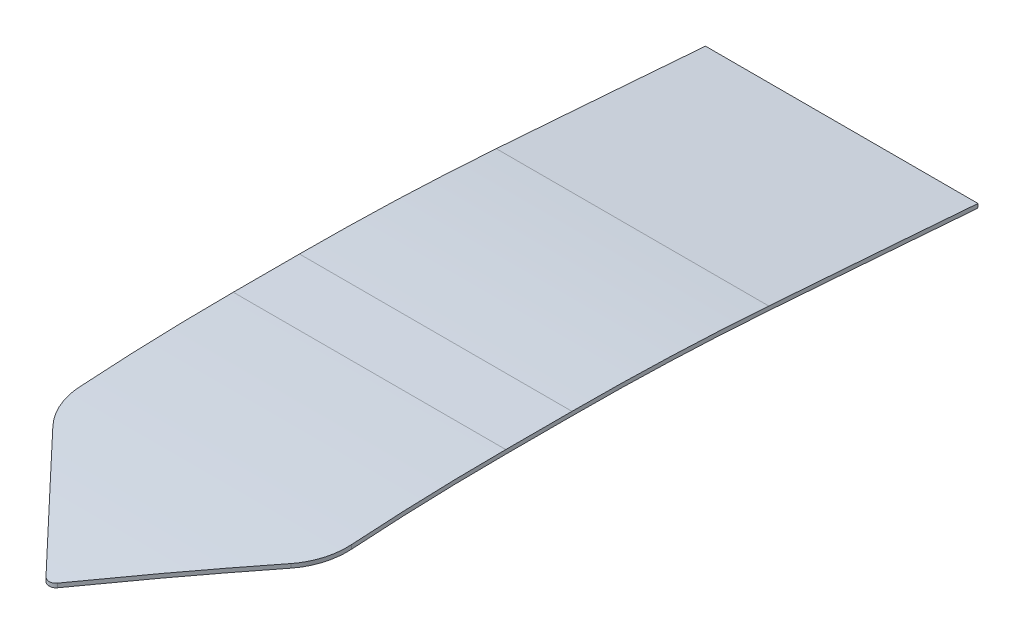
ISO-10303-21;
HEADER;
FILE_DESCRIPTION(('STEP AP214'),'2;1');
FILE_NAME('part.step','',(''),(''),'','','');
FILE_SCHEMA(('AUTOMOTIVE_DESIGN { 1 0 10303 214 1 1 1 1 }'));
ENDSEC;
DATA;
#1=APPLICATION_CONTEXT('core data for automotive mechanical design processes');
#2=APPLICATION_PROTOCOL_DEFINITION('international standard','automotive_design',2000,#1);
#3=PRODUCT_CONTEXT('',#1,'mechanical');
#4=PRODUCT('Part','Part','',(#3));
#5=PRODUCT_RELATED_PRODUCT_CATEGORY('part','',(#4));
#6=PRODUCT_DEFINITION_FORMATION('','',#4);
#7=PRODUCT_DEFINITION_CONTEXT('part definition',#1,'design');
#8=PRODUCT_DEFINITION('design','',#6,#7);
#9=PRODUCT_DEFINITION_SHAPE('','',#8);
#10=(LENGTH_UNIT() NAMED_UNIT(*) SI_UNIT(.MILLI.,.METRE.));
#11=(NAMED_UNIT(*) PLANE_ANGLE_UNIT() SI_UNIT($,.RADIAN.));
#12=(NAMED_UNIT(*) SI_UNIT($,.STERADIAN.) SOLID_ANGLE_UNIT());
#13=UNCERTAINTY_MEASURE_WITH_UNIT(LENGTH_MEASURE(1.E-05),#10,'distance_accuracy_value','');
#14=(GEOMETRIC_REPRESENTATION_CONTEXT(3) GLOBAL_UNCERTAINTY_ASSIGNED_CONTEXT((#13)) GLOBAL_UNIT_ASSIGNED_CONTEXT((#10,
#11,#12)) REPRESENTATION_CONTEXT('',''));
#15=CARTESIAN_POINT('',(0.,0.,0.));
#16=DIRECTION('',(0.,0.,1.));
#17=DIRECTION('',(1.,0.,0.));
#18=AXIS2_PLACEMENT_3D('',#15,#16,#17);
#19=CARTESIAN_POINT('',(45.2232043677211,2377.37290200874,4692.88338211628));
#20=DIRECTION('',(0.,-0.139146483242731,0.990271809252985));
#21=DIRECTION('',(0.,-0.990271809252985,-0.139146483242731));
#22=AXIS2_PLACEMENT_3D('',#19,#20,#21);
#23=PLANE('',#22);
#24=CARTESIAN_POINT('',(914.223204367722,2000.18474268708,4639.88338211628));
#25=DIRECTION('',(0.,-0.139146483242731,0.990271809252985));
#26=DIRECTION('',(0.,-0.990271809252985,-0.139146483242731));
#27=AXIS2_PLACEMENT_3D('',#24,#25,#26);
#28=ELLIPSE('',#27,359.333551483146,50.0000000000007);
#29=CARTESIAN_POINT('',(906.933035038163,2352.21999805371,4689.34906144191));
#30=VERTEX_POINT('',#29);
#31=CARTESIAN_POINT('',(921.513373697281,2352.21999805371,4689.34906144191));
#32=VERTEX_POINT('',#31);
#33=EDGE_CURVE('E66',#30,#32,#28,.F.);
#34=ORIENTED_EDGE('',*,*,#33,.F.);
#35=DIRECTION('',(1.,0.,0.));
#36=VECTOR('',#35,1.);
#37=CARTESIAN_POINT('',(45.2232043677211,2352.21999805371,4689.34906144191));
#38=LINE('',#37,#36);
#39=EDGE_CURVE('E194',#30,#32,#38,.T.);
#40=ORIENTED_EDGE('',*,*,#39,.T.);
#41=EDGE_LOOP('',(#34,#40));
#42=FACE_BOUND('',#41,.T.);
#43=ADVANCED_FACE('F37',(#42),#23,.T.);
#44=CARTESIAN_POINT('',(45.2232043677211,-264700.723222564,20532.1872081631));
#45=DIRECTION('',(1.,0.,0.));
#46=DIRECTION('',(0.,0.,-1.));
#47=AXIS2_PLACEMENT_3D('',#44,#45,#46);
#48=CYLINDRICAL_SURFACE('',#47,267886.279258507);
#49=CARTESIAN_POINT('',(1773.22320436772,-264700.723222564,20532.1872081631));
#50=DIRECTION('',(-1.,0.,0.));
#51=DIRECTION('',(0.,0.,1.));
#52=AXIS2_PLACEMENT_3D('',#49,#50,#51);
#53=CIRCLE('',#52,267886.279258507);
#54=CARTESIAN_POINT('',(1773.22320436772,2373.84259870677,-306.11661788372));
#55=VERTEX_POINT('',#54);
#56=CARTESIAN_POINT('',(1773.22320436772,2473.47300835498,1012.77422187486));
#57=VERTEX_POINT('',#56);
#58=EDGE_CURVE('E170',#55,#57,#53,.F.);
#59=ORIENTED_EDGE('',*,*,#58,.F.);
#60=DIRECTION('',(1.,0.,0.));
#61=VECTOR('',#60,1.);
#62=CARTESIAN_POINT('',(45.2232043677211,2373.84259870677,-306.11661788372));
#63=LINE('',#62,#61);
#64=CARTESIAN_POINT('',(55.2232043677214,2373.84259870683,-306.116617883722));
#65=VERTEX_POINT('',#64);
#66=EDGE_CURVE('E164',#65,#55,#63,.T.);
#67=ORIENTED_EDGE('',*,*,#66,.F.);
#68=CARTESIAN_POINT('',(55.2232043677249,-264700.723222564,20532.1872081631));
#69=DIRECTION('',(1.,0.,0.));
#70=DIRECTION('',(0.,0.,-1.));
#71=AXIS2_PLACEMENT_3D('',#68,#69,#70);
#72=CIRCLE('',#71,267886.279258507);
#73=CARTESIAN_POINT('',(55.2232043677217,2473.47300835498,1012.77422187486));
#74=VERTEX_POINT('',#73);
#75=EDGE_CURVE('E147',#74,#65,#72,.F.);
#76=ORIENTED_EDGE('',*,*,#75,.F.);
#77=DIRECTION('',(1.,0.,0.));
#78=VECTOR('',#77,1.);
#79=CARTESIAN_POINT('',(45.2232043677211,2473.47300835497,1012.77422187486));
#80=LINE('',#79,#78);
#81=EDGE_CURVE('E203',#74,#57,#80,.T.);
#82=ORIENTED_EDGE('',*,*,#81,.T.);
#83=EDGE_LOOP('',(#59,#67,#76,#82));
#84=FACE_BOUND('',#83,.T.);
#85=ADVANCED_FACE('F39',(#84),#48,.T.);
#86=CARTESIAN_POINT('',(45.2232043677211,2373.84259870677,-306.11661788372));
#87=DIRECTION('',(0.,-0.0777878728384363,-0.996969932765914));
#88=DIRECTION('',(0.,0.996969932765914,-0.0777878728384363));
#89=AXIS2_PLACEMENT_3D('',#86,#87,#88);
#90=PLANE('',#89);
#91=DIRECTION('',(0.,0.996969932765914,-0.0777878728384363));
#92=VECTOR('',#91,1.);
#93=CARTESIAN_POINT('',(1773.22320436772,2373.84259870677,-306.11661788372));
#94=LINE('',#93,#92);
#95=CARTESIAN_POINT('',(1773.22320436772,2348.51956241448,-304.14080591362));
#96=VERTEX_POINT('',#95);
#97=EDGE_CURVE('E326',#96,#55,#94,.T.);
#98=ORIENTED_EDGE('',*,*,#97,.F.);
#99=DIRECTION('',(1.,0.,0.));
#100=VECTOR('',#99,1.);
#101=CARTESIAN_POINT('',(45.2232043677211,2348.51956241448,-304.140805913644));
#102=LINE('',#101,#100);
#103=CARTESIAN_POINT('',(55.2232043677214,2348.51956241448,-304.14080591362));
#104=VERTEX_POINT('',#103);
#105=EDGE_CURVE('E166',#104,#96,#102,.T.);
#106=ORIENTED_EDGE('',*,*,#105,.F.);
#107=DIRECTION('',(0.,-0.996969932765914,0.0777878728384363));
#108=VECTOR('',#107,1.);
#109=CARTESIAN_POINT('',(55.2232043677214,2373.84259870677,-306.11661788372));
#110=LINE('',#109,#108);
#111=EDGE_CURVE('E150',#65,#104,#110,.T.);
#112=ORIENTED_EDGE('',*,*,#111,.F.);
#113=ORIENTED_EDGE('',*,*,#66,.T.);
#114=EDGE_LOOP('',(#98,#106,#112,#113));
#115=FACE_BOUND('',#114,.T.);
#116=ADVANCED_FACE('F163',(#115),#90,.T.);
#117=CARTESIAN_POINT('',(45.2232043677211,-264700.723222564,20532.1872081631));
#118=DIRECTION('',(1.,0.,0.));
#119=DIRECTION('',(0.,0.,-1.));
#120=AXIS2_PLACEMENT_3D('',#117,#118,#119);
#121=CYLINDRICAL_SURFACE('',#120,267860.879258507);
#122=CARTESIAN_POINT('',(1773.22320436772,-264700.723222564,20532.1872081631));
#123=DIRECTION('',(-1.,0.,0.));
#124=DIRECTION('',(0.,0.,1.));
#125=AXIS2_PLACEMENT_3D('',#122,#123,#124);
#126=CIRCLE('',#125,267860.879258507);
#127=CARTESIAN_POINT('',(1773.22320436772,2448.14052547071,1014.62498142564));
#128=VERTEX_POINT('',#127);
#129=EDGE_CURVE('E328',#128,#96,#126,.T.);
#130=ORIENTED_EDGE('',*,*,#129,.F.);
#131=DIRECTION('',(1.,0.,0.));
#132=VECTOR('',#131,1.);
#133=CARTESIAN_POINT('',(45.2232043677211,2448.14052547069,1014.62498142564));
#134=LINE('',#133,#132);
#135=CARTESIAN_POINT('',(55.2232043677217,2448.14052547071,1014.62498142564));
#136=VERTEX_POINT('',#135);
#137=EDGE_CURVE('E174',#136,#128,#134,.T.);
#138=ORIENTED_EDGE('',*,*,#137,.F.);
#139=CARTESIAN_POINT('',(55.2232043677249,-264700.723222564,20532.1872081631));
#140=DIRECTION('',(1.,0.,0.));
#141=DIRECTION('',(0.,0.,-1.));
#142=AXIS2_PLACEMENT_3D('',#139,#140,#141);
#143=CIRCLE('',#142,267860.879258507);
#144=EDGE_CURVE('E167',#104,#136,#143,.T.);
#145=ORIENTED_EDGE('',*,*,#144,.F.);
#146=ORIENTED_EDGE('',*,*,#105,.T.);
#147=EDGE_LOOP('',(#130,#138,#145,#146));
#148=FACE_BOUND('',#147,.T.);
#149=ADVANCED_FACE('F276',(#148),#121,.F.);
#150=CARTESIAN_POINT('',(45.2232043677211,-14509.8457253538,2253.55427068807));
#151=DIRECTION('',(1.,0.,0.));
#152=DIRECTION('',(0.,0.,-1.));
#153=AXIS2_PLACEMENT_3D('',#150,#151,#152);
#154=CYLINDRICAL_SURFACE('',#153,17003.1833333334);
#155=CARTESIAN_POINT('',(1773.22320436772,-14509.8457253538,2253.55427068807));
#156=DIRECTION('',(-1.,0.,0.));
#157=DIRECTION('',(0.,0.,1.));
#158=AXIS2_PLACEMENT_3D('',#155,#156,#157);
#159=CIRCLE('',#158,17003.1833333334);
#160=CARTESIAN_POINT('',(1773.22320436772,2493.33760797954,2253.55427068807));
#161=VERTEX_POINT('',#160);
#162=EDGE_CURVE('E330',#161,#128,#159,.T.);
#163=ORIENTED_EDGE('',*,*,#162,.F.);
#164=DIRECTION('',(1.,0.,0.));
#165=VECTOR('',#164,1.);
#166=CARTESIAN_POINT('',(45.2232043677211,2493.33760797949,2253.55427068807));
#167=LINE('',#166,#165);
#168=CARTESIAN_POINT('',(55.2232043677219,2493.33760797954,2253.55427068807));
#169=VERTEX_POINT('',#168);
#170=EDGE_CURVE('E188',#169,#161,#167,.T.);
#171=ORIENTED_EDGE('',*,*,#170,.F.);
#172=CARTESIAN_POINT('',(55.2232043677219,-14509.8457253538,2253.55427068807));
#173=DIRECTION('',(1.,0.,0.));
#174=DIRECTION('',(0.,0.,-1.));
#175=AXIS2_PLACEMENT_3D('',#172,#173,#174);
#176=CIRCLE('',#175,17003.1833333334);
#177=EDGE_CURVE('E315',#136,#169,#176,.T.);
#178=ORIENTED_EDGE('',*,*,#177,.F.);
#179=ORIENTED_EDGE('',*,*,#137,.T.);
#180=EDGE_LOOP('',(#163,#171,#178,#179));
#181=FACE_BOUND('',#180,.T.);
#182=ADVANCED_FACE('F278',(#181),#154,.F.);
#183=CARTESIAN_POINT('',(45.2232043677211,2493.33760797949,2670.88338211628));
#184=DIRECTION('',(0.,-1.,0.));
#185=DIRECTION('',(0.,0.,-1.));
#186=AXIS2_PLACEMENT_3D('',#183,#184,#185);
#187=PLANE('',#186);
#188=DIRECTION('',(0.,0.,-1.));
#189=VECTOR('',#188,1.);
#190=CARTESIAN_POINT('',(1773.22320436772,2493.33760797949,2670.88338211628));
#191=LINE('',#190,#189);
#192=CARTESIAN_POINT('',(1773.22320436772,2493.33760797949,2670.88338211628));
#193=VERTEX_POINT('',#192);
#194=EDGE_CURVE('E332',#193,#161,#191,.T.);
#195=ORIENTED_EDGE('',*,*,#194,.F.);
#196=DIRECTION('',(1.,0.,0.));
#197=VECTOR('',#196,1.);
#198=CARTESIAN_POINT('',(45.2232043677211,2493.33760797949,2670.88338211628));
#199=LINE('',#198,#197);
#200=CARTESIAN_POINT('',(55.2232043677219,2493.33760797949,2670.88338211628));
#201=VERTEX_POINT('',#200);
#202=EDGE_CURVE('E191',#201,#193,#199,.T.);
#203=ORIENTED_EDGE('',*,*,#202,.F.);
#204=DIRECTION('',(0.,0.,1.));
#205=VECTOR('',#204,1.);
#206=CARTESIAN_POINT('',(55.2232043677219,2493.33760797949,2670.88338211628));
#207=LINE('',#206,#205);
#208=EDGE_CURVE('E317',#169,#201,#207,.T.);
#209=ORIENTED_EDGE('',*,*,#208,.F.);
#210=ORIENTED_EDGE('',*,*,#170,.T.);
#211=EDGE_LOOP('',(#195,#203,#209,#210));
#212=FACE_BOUND('',#211,.T.);
#213=ADVANCED_FACE('F253',(#212),#187,.T.);
#214=CARTESIAN_POINT('',(45.2232043677211,-12012.7112139923,2670.88338211628));
#215=DIRECTION('',(1.,0.,0.));
#216=DIRECTION('',(0.,0.,-1.));
#217=AXIS2_PLACEMENT_3D('',#214,#215,#216);
#218=CYLINDRICAL_SURFACE('',#217,14506.0488219718);
#219=CARTESIAN_POINT('',(921.51337369727,2352.21999805371,4689.34906144192));
#220=CARTESIAN_POINT('',(922.21506473011,2352.23452767716,4689.2456569626));
#221=CARTESIAN_POINT('',(922.914502984035,2352.25115589871,4689.12731048837));
#222=CARTESIAN_POINT('',(924.30760756184,2352.28856881362,4688.86100444222));
#223=CARTESIAN_POINT('',(925.001273883102,2352.30935350887,4688.71304485686));
#224=CARTESIAN_POINT('',(926.381498700596,2352.3550363536,4688.38779980709));
#225=CARTESIAN_POINT('',(927.068057899352,2352.37993409231,4688.21051727118));
#226=CARTESIAN_POINT('',(928.43282260401,2352.433788896,4687.82698788175));
#227=CARTESIAN_POINT('',(929.111028167007,2352.46274593322,4687.62074122633));
#228=CARTESIAN_POINT('',(931.094306615048,2352.55392260533,4686.97121979929));
#229=CARTESIAN_POINT('',(932.386326708612,2352.62172298832,4686.48808740303));
#230=CARTESIAN_POINT('',(934.925127448912,2352.77193822164,4685.4172042993));
#231=CARTESIAN_POINT('',(936.171909910408,2352.85435248493,4684.82945779415));
#232=CARTESIAN_POINT('',(938.606117434128,2353.03273853764,4683.5566111077));
#233=CARTESIAN_POINT('',(939.793797341582,2353.12864375881,4682.87198884635));
#234=CARTESIAN_POINT('',(942.108328880202,2353.33360374526,4681.40800670519));
#235=CARTESIAN_POINT('',(943.235177718645,2353.44265911351,4680.62864248115));
#236=CARTESIAN_POINT('',(944.889169256061,2353.61706770111,4679.38140573184));
#237=CARTESIAN_POINT('',(945.441692034682,2353.67791179112,4678.9461588684));
#238=CARTESIAN_POINT('',(946.527722079309,2353.80273837289,4678.05290293244));
#239=CARTESIAN_POINT('',(947.061229177571,2353.86672089232,4677.5948936592));
#240=CARTESIAN_POINT('',(948.108261625646,2353.99769779909,4676.65697189825));
#241=CARTESIAN_POINT('',(948.621786300946,2354.06469228792,4676.17705867236));
#242=CARTESIAN_POINT('',(949.627959871744,2354.20156105467,4675.19622818642));
#243=CARTESIAN_POINT('',(950.120608962849,2354.27143530558,4674.69531112327));
#244=CARTESIAN_POINT('',(950.602387573722,2354.34268503065,4674.18433005164));
#245=B_SPLINE_CURVE_WITH_KNOTS('',3,(#219,#220,#221,#222,#223,#224,#225,#226,#227,#228,#229,
#230,#231,#232,#233,#234,#235,#236,#237,#238,#239,#240,#241,#242,#243,#244),.UNSPECIFIED.,.F.,
.F.,(4,2,2,2,2,2,2,2,2,2,2,2,4),(0.,2.12807673484801,4.2561544351893,6.38401973144155,
8.5118704760785,12.6498508082088,16.7876649564927,20.9057349002427,25.0239937419562,
27.1414445137977,29.2589139597743,31.3764548198833,33.4939758340309),.UNSPECIFIED.);
#246=CARTESIAN_POINT('',(950.602387573723,2354.34268503065,4674.18433005164));
#247=VERTEX_POINT('',#246);
#248=EDGE_CURVE('E177',#32,#247,#245,.T.);
#249=ORIENTED_EDGE('',*,*,#248,.F.);
#250=ORIENTED_EDGE('',*,*,#39,.F.);
#251=CARTESIAN_POINT('',(877.844021161721,2354.34268503065,4674.18433005164));
#252=CARTESIAN_POINT('',(878.329861245632,2354.27083461355,4674.69961910379));
#253=CARTESIAN_POINT('',(878.826756079497,2354.20038299,4675.2046735263));
#254=CARTESIAN_POINT('',(879.841767295522,2354.06240933201,4676.19341565996));
#255=CARTESIAN_POINT('',(880.359883886545,2353.99488732641,4676.67710316072));
#256=CARTESIAN_POINT('',(881.416429123758,2353.86290781771,4677.62219313671));
#257=CARTESIAN_POINT('',(881.954857310566,2353.79845024539,4678.08359611541));
#258=CARTESIAN_POINT('',(883.05102714749,2353.67272994211,4678.98323202015));
#259=CARTESIAN_POINT('',(883.608768617699,2353.6114671814,4679.42146516193));
#260=CARTESIAN_POINT('',(885.278282889158,2353.43593898185,4680.67668123549));
#261=CARTESIAN_POINT('',(886.415804383918,2353.32626177184,4681.46046882292));
#262=CARTESIAN_POINT('',(888.752471660079,2353.12029638244,4682.93159054564));
#263=CARTESIAN_POINT('',(889.951613715059,2353.02400739473,4683.6189305041));
#264=CARTESIAN_POINT('',(892.389395376219,2352.84655930235,4684.88504337178));
#265=CARTESIAN_POINT('',(893.627422017235,2352.76523890806,4685.46497411815));
#266=CARTESIAN_POINT('',(896.147743799084,2352.61698884484,4686.52182574149));
#267=CARTESIAN_POINT('',(897.430040117132,2352.55005955894,4686.9987438767));
#268=CARTESIAN_POINT('',(899.397891188829,2352.46002759352,4687.64010349548));
#269=CARTESIAN_POINT('',(900.07065915465,2352.43143132342,4687.84377877053));
#270=CARTESIAN_POINT('',(901.42437756804,2352.37823156894,4688.22264042833));
#271=CARTESIAN_POINT('',(902.105328068041,2352.35362811016,4688.39782662843));
#272=CARTESIAN_POINT('',(903.474202299119,2352.30846559128,4688.7193658194));
#273=CARTESIAN_POINT('',(904.162126779059,2352.28790697046,4688.86571567861));
#274=CARTESIAN_POINT('',(905.543640840506,2352.25087708823,4689.12929485086));
#275=CARTESIAN_POINT('',(906.237230420717,2352.23440582589,4689.24652417057));
#276=CARTESIAN_POINT('',(906.933035038174,2352.21999805371,4689.34906144192));
#277=B_SPLINE_CURVE_WITH_KNOTS('',3,(#251,#252,#253,#254,#255,#256,#257,#258,#259,#260,#261,
#262,#263,#264,#265,#266,#267,#268,#269,#270,#271,#272,#273,#274,#275,#276),.UNSPECIFIED.,.F.,
.F.,(4,2,2,2,2,2,2,2,2,2,2,2,4),(0.,2.1353699896864,4.27076100069206,6.40610374498263,
8.54142660340992,12.6934924310105,16.8453074629389,20.9493669179568,25.0535355919608,
27.1635210711449,29.2735200783063,31.3837481087276,33.4939756566979),.UNSPECIFIED.);
#278=CARTESIAN_POINT('',(877.844021161721,2354.34268503065,4674.18433005164));
#279=VERTEX_POINT('',#278);
#280=EDGE_CURVE('E259',#279,#30,#277,.T.);
#281=ORIENTED_EDGE('',*,*,#280,.F.);
#282=CARTESIAN_POINT('',(-1011.01426146886,-12012.7112139923,2670.88338211628));
#283=DIRECTION('',(0.727583664120001,0.,-0.686018958707202));
#284=DIRECTION('',(0.686018958707202,0.,0.727583664120001));
#285=AXIS2_PLACEMENT_3D('',#282,#283,#284);
#286=ELLIPSE('',#285,19937.2931764715,14506.0488219718);
#287=CARTESIAN_POINT('',(164.189738719721,2439.69068193024,3917.29096559916));
#288=VERTEX_POINT('',#287);
#289=EDGE_CURVE('E242',#288,#279,#286,.T.);
#290=ORIENTED_EDGE('',*,*,#289,.F.);
#291=CARTESIAN_POINT('',(55.2232043677214,2460.73579856933,3642.88338211628));
#292=CARTESIAN_POINT('',(55.2232039742321,2460.54659749145,3645.70066217426));
#293=CARTESIAN_POINT('',(55.2529692471856,2460.356578425,3648.51780854771));
#294=CARTESIAN_POINT('',(55.3720029625047,2459.97498218327,3654.150721092));
#295=CARTESIAN_POINT('',(55.4612710421338,2459.78340501751,3656.96648727114));
#296=CARTESIAN_POINT('',(55.8182743281085,2459.20647145311,3665.40977941514));
#297=CARTESIAN_POINT('',(56.1752085882087,2458.81889156623,3671.03361794503));
#298=CARTESIAN_POINT('',(57.1262850767965,2458.03858700287,3682.26080267629));
#299=CARTESIAN_POINT('',(57.7204256554138,2457.64586236218,3687.8641490199));
#300=CARTESIAN_POINT('',(58.7886340623536,2457.05353308871,3696.24597106399));
#301=CARTESIAN_POINT('',(59.1742084939897,2456.85554734995,3699.03607698955));
#302=CARTESIAN_POINT('',(60.0042146733265,2456.45857535964,3704.6076358589));
#303=CARTESIAN_POINT('',(60.4486502552973,2456.25958904372,3707.3890882269));
#304=CARTESIAN_POINT('',(61.8710217721548,2455.66084515924,3715.72472862197));
#305=CARTESIAN_POINT('',(62.9372320713567,2455.25974102982,3721.26399760081));
#306=CARTESIAN_POINT('',(65.3028932160588,2454.45485563809,3732.29230782673));
#307=CARTESIAN_POINT('',(66.6023441085354,2454.05107437524,3737.7813490637));
#308=CARTESIAN_POINT('',(68.7245777093714,2453.44410095497,3745.96957577129));
#309=CARTESIAN_POINT('',(69.4608460017912,2453.24155605004,3748.69147544899));
#310=CARTESIAN_POINT('',(70.9907103932562,2452.83615387845,3754.11889585208));
#311=CARTESIAN_POINT('',(71.78430274761,2452.63329663304,3756.82441763486));
#312=CARTESIAN_POINT('',(74.2506638620868,2452.02440397227,3764.91499809747));
#313=CARTESIAN_POINT('',(76.0090505118607,2451.61803795238,3770.27420244081));
#314=CARTESIAN_POINT('',(79.751886850727,2450.8052159188,3780.91644789168));
#315=CARTESIAN_POINT('',(81.7364687804954,2450.39875999254,3786.19944239047));
#316=CARTESIAN_POINT('',(85.9273781279523,2449.58698250238,3796.67684011057));
#317=CARTESIAN_POINT('',(88.1337062066545,2449.18166094185,3801.87124306774));
#318=CARTESIAN_POINT('',(92.7646506692909,2448.37310045983,3812.16315592048));
#319=CARTESIAN_POINT('',(95.1893011799193,2447.96986187437,3817.26065051665));
#320=CARTESIAN_POINT('',(98.9862662985561,2447.36744017647,3824.82625075674));
#321=CARTESIAN_POINT('',(100.278594780279,2447.16703773289,3827.33469260499));
#322=CARTESIAN_POINT('',(102.916158588209,2446.76715220203,3832.32389552951));
#323=CARTESIAN_POINT('',(104.26139737928,2446.56766917591,3834.80465477927));
#324=CARTESIAN_POINT('',(108.369189069795,2445.97173105959,3842.1921760875));
#325=CARTESIAN_POINT('',(111.209732724805,2445.57684811241,3847.05596667288));
#326=CARTESIAN_POINT('',(117.093853414398,2444.7923910273,3856.65956186032));
#327=CARTESIAN_POINT('',(120.137429887642,2444.40281687471,3861.39936680512));
#328=CARTESIAN_POINT('',(124.850153701555,2443.82334847105,3868.40848190705));
#329=CARTESIAN_POINT('',(126.445287378577,2443.63104582006,3870.72763395207));
#330=CARTESIAN_POINT('',(129.684109924609,2443.24818045866,3875.33169870879));
#331=CARTESIAN_POINT('',(131.327796009437,2443.05761764931,3877.61661337251));
#332=CARTESIAN_POINT('',(136.330434123002,2442.48876148114,3884.4182154559));
#333=CARTESIAN_POINT('',(139.761500246213,2442.11323466108,3888.882555508));
#334=CARTESIAN_POINT('',(144.947473936828,2441.56685786314,3895.34333216452));
#335=CARTESIAN_POINT('',(146.630445343022,2441.39267092573,3897.39774882876));
#336=CARTESIAN_POINT('',(150.036791938909,2441.04633084067,3901.47244424676));
#337=CARTESIAN_POINT('',(151.760159928196,2440.87417733867,3903.49272897547));
#338=CARTESIAN_POINT('',(155.244961329322,2440.5321767893,3907.4964763));
#339=CARTESIAN_POINT('',(157.006351038102,2440.36232742485,3909.47997675886));
#340=CARTESIAN_POINT('',(160.568646251504,2440.02482332397,3913.41199586615));
#341=CARTESIAN_POINT('',(162.369558629362,2439.85716897749,3915.36050832108));
#342=CARTESIAN_POINT('',(164.189738719721,2439.69068193025,3917.29096559916));
#343=B_SPLINE_CURVE_WITH_KNOTS('',3,(#291,#292,#293,#294,#295,#296,#297,#298,#299,#300,#301,
#302,#303,#304,#305,#306,#307,#308,#309,#310,#311,#312,#313,#314,#315,#316,#317,#318,#319,#320,
#321,#322,#323,#324,#325,#326,#327,#328,#329,#330,#331,#332,#333,#334,#335,#336,#337,#338,#339,
#340,#341,#342),.UNSPECIFIED.,.F.,.F.,(4,2,2,2,2,2,2,2,2,2,2,2,2,2,2,2,2,2,2,2,2,2,2,2,2,4),(0.,
8.47056410828529,16.9410765794415,33.8811432717726,50.8210921408189,59.2912585660099,
67.7619770173667,84.7222021575464,101.682430713651,110.162838019591,118.6426918435,
135.601994187219,152.571262813279,169.540582025344,186.512558387341,194.998652311611,
203.48530288106,220.41897740048,237.352605104043,245.816030604072,254.278971717292,
271.201977032418,279.185973065126,287.168556668125,295.142407916372,303.117657030611),.UNSPECIFIED.);
#344=CARTESIAN_POINT('',(55.2232043677221,2460.73579856933,3642.88338211628));
#345=VERTEX_POINT('',#344);
#346=EDGE_CURVE('E234',#345,#288,#343,.T.);
#347=ORIENTED_EDGE('',*,*,#346,.F.);
#348=CARTESIAN_POINT('',(55.2232043677219,-12012.7112139923,2670.88338211628));
#349=DIRECTION('',(1.,0.,0.));
#350=DIRECTION('',(0.,0.,-1.));
#351=AXIS2_PLACEMENT_3D('',#348,#349,#350);
#352=CIRCLE('',#351,14506.0488219718);
#353=EDGE_CURVE('E319',#201,#345,#352,.T.);
#354=ORIENTED_EDGE('',*,*,#353,.F.);
#355=ORIENTED_EDGE('',*,*,#202,.T.);
#356=CARTESIAN_POINT('',(1773.22320436772,-12012.7112139923,2670.88338211628));
#357=DIRECTION('',(-1.,0.,0.));
#358=DIRECTION('',(0.,0.,1.));
#359=AXIS2_PLACEMENT_3D('',#356,#357,#358);
#360=CIRCLE('',#359,14506.0488219718);
#361=CARTESIAN_POINT('',(1773.22320436772,2460.73579856933,3642.88338211628));
#362=VERTEX_POINT('',#361);
#363=EDGE_CURVE('E333',#362,#193,#360,.T.);
#364=ORIENTED_EDGE('',*,*,#363,.F.);
#365=CARTESIAN_POINT('',(1664.25667001572,2439.69068193024,3917.29096559916));
#366=CARTESIAN_POINT('',(1666.18936501,2439.86746072025,3915.24117249666));
#367=CARTESIAN_POINT('',(1668.10029271138,2440.0455510088,3913.17107717364));
#368=CARTESIAN_POINT('',(1671.87787390387,2440.40423125793,3908.99111245711));
#369=CARTESIAN_POINT('',(1673.74452766948,2440.584821203,3906.88124331037));
#370=CARTESIAN_POINT('',(1679.27679265726,2441.13013800039,3900.49342640975));
#371=CARTESIAN_POINT('',(1682.87492943496,2441.49843212112,3896.15703387754));
#372=CARTESIAN_POINT('',(1689.88444595649,2442.24342120222,3887.33663117369));
#373=CARTESIAN_POINT('',(1693.2958279048,2442.62011606334,3882.85262274551));
#374=CARTESIAN_POINT('',(1698.26815889411,2443.19062810565,3876.02220351824));
#375=CARTESIAN_POINT('',(1699.90149678005,2443.38171263142,3873.7279691369));
#376=CARTESIAN_POINT('',(1703.11940025959,2443.76559203475,3869.10546562428));
#377=CARTESIAN_POINT('',(1704.70396266812,2443.95838702294,3866.77719428495));
#378=CARTESIAN_POINT('',(1709.38672437861,2444.53954727234,3859.73788798394));
#379=CARTESIAN_POINT('',(1712.41045637259,2444.93028123561,3854.97722601232));
#380=CARTESIAN_POINT('',(1718.25376774104,2445.71694332407,3845.3326374501));
#381=CARTESIAN_POINT('',(1721.07334705756,2446.11287145072,3840.4487108245));
#382=CARTESIAN_POINT('',(1725.14572733177,2446.70983275244,3833.03722905756));
#383=CARTESIAN_POINT('',(1726.47704512848,2446.90933498035,3830.55242445868));
#384=CARTESIAN_POINT('',(1729.08674448368,2447.30922570211,3825.55545299056));
#385=CARTESIAN_POINT('',(1730.36512949301,2447.50961413725,3823.04328791856));
#386=CARTESIAN_POINT('',(1734.12020961358,2448.11194022182,3815.46705893547));
#387=CARTESIAN_POINT('',(1736.51689463252,2448.51504815598,3810.36314329256));
#388=CARTESIAN_POINT('',(1741.09355987024,2449.32351372084,3800.05595527606));
#389=CARTESIAN_POINT('',(1743.27341703724,2449.72887249269,3794.85262845984));
#390=CARTESIAN_POINT('',(1747.41112798227,2450.54060838596,3784.3585027325));
#391=CARTESIAN_POINT('',(1749.36898110337,2450.94698551039,3779.0677035626));
#392=CARTESIAN_POINT('',(1753.0595232677,2451.75983767825,3768.40704885227));
#393=CARTESIAN_POINT('',(1754.79217726154,2452.16631272708,3763.03718115027));
#394=CARTESIAN_POINT('',(1757.21954585273,2452.77528270607,3754.93143675161));
#395=CARTESIAN_POINT('',(1758.00007098994,2452.97815019841,3752.22101438591));
#396=CARTESIAN_POINT('',(1759.50367831066,2453.38354531019,3746.78406150899));
#397=CARTESIAN_POINT('',(1760.22675672997,2453.58607290652,3744.05752995477));
#398=CARTESIAN_POINT('',(1762.30607768091,2454.19203030098,3735.86829347282));
#399=CARTESIAN_POINT('',(1763.5761566528,2454.59477611609,3730.38341899274));
#400=CARTESIAN_POINT('',(1765.8837196864,2455.39749813495,3719.36477574687));
#401=CARTESIAN_POINT('',(1766.92120436723,2455.79747434607,3713.83100711128));
#402=CARTESIAN_POINT('',(1768.30136308951,2456.39460792672,3705.50258042207));
#403=CARTESIAN_POINT('',(1768.73200296436,2456.59314136646,3702.7223662679));
#404=CARTESIAN_POINT('',(1769.53452018998,2456.98918684123,3697.15358428027));
#405=CARTESIAN_POINT('',(1769.90640090042,2457.18669893403,3694.36501693372));
#406=CARTESIAN_POINT('',(1770.93359220736,2457.77752881892,3685.98893869894));
#407=CARTESIAN_POINT('',(1771.50060787706,2458.16920768139,3680.3901108055));
#408=CARTESIAN_POINT('',(1772.16160301644,2458.74236766144,3672.12797952516));
#409=CARTESIAN_POINT('',(1772.34743152432,2458.92590044153,3669.47176228338));
#410=CARTESIAN_POINT('',(1772.66599371019,2459.29169131395,3664.15647037981));
#411=CARTESIAN_POINT('',(1772.79873678506,2459.47394962625,3661.49739630734));
#412=CARTESIAN_POINT('',(1773.01098902188,2459.83694202011,3656.17998259676));
#413=CARTESIAN_POINT('',(1773.09055664574,2460.01767755917,3653.52164537456));
#414=CARTESIAN_POINT('',(1773.19667049928,2460.37778626741,3648.20335204109));
#415=CARTESIAN_POINT('',(1773.22320742563,2460.55715919205,3645.54339572764));
#416=CARTESIAN_POINT('',(1773.22320436772,2460.73579856933,3642.88338211628));
#417=B_SPLINE_CURVE_WITH_KNOTS('',3,(#365,#366,#367,#368,#369,#370,#371,#372,#373,#374,#375,
#376,#377,#378,#379,#380,#381,#382,#383,#384,#385,#386,#387,#388,#389,#390,#391,#392,#393,#394,
#395,#396,#397,#398,#399,#400,#401,#402,#403,#404,#405,#406,#407,#408,#409,#410,#411,#412,#413,
#414,#415,#416),.UNSPECIFIED.,.F.,.F.,(4,2,2,2,2,2,2,2,2,2,2,2,2,2,2,2,2,2,2,2,2,2,2,2,2,4),(0.,
8.46809217064177,16.936131822647,33.8712397585886,50.8061477474055,59.2737957109942,
67.741995447984,84.6964750550325,101.650959475137,110.128506043516,118.605499063895,
135.559080630508,152.522229263103,169.485428089713,186.451263870209,194.934287752613,
203.417867026465,220.34572459615,237.273537105924,245.734070638038,254.194120246184,
271.111353566356,279.118052374384,287.123333253688,295.119798461796,303.117666391028),.UNSPECIFIED.);
#418=CARTESIAN_POINT('',(1664.25667001572,2439.69068193024,3917.29096559916));
#419=VERTEX_POINT('',#418);
#420=EDGE_CURVE('E241',#419,#362,#417,.T.);
#421=ORIENTED_EDGE('',*,*,#420,.F.);
#422=CARTESIAN_POINT('',(2839.4606702043,-12012.7112139923,2670.88338211628));
#423=DIRECTION('',(-0.727583664120001,0.,-0.686018958707202));
#424=DIRECTION('',(0.686018958707202,0.,-0.727583664120001));
#425=AXIS2_PLACEMENT_3D('',#422,#423,#424);
#426=ELLIPSE('',#425,19937.2931764715,14506.0488219718);
#427=EDGE_CURVE('E293',#247,#419,#426,.T.);
#428=ORIENTED_EDGE('',*,*,#427,.F.);
#429=EDGE_LOOP('',(#249,#250,#281,#290,#347,#354,#355,#364,#421,#428));
#430=FACE_BOUND('',#429,.T.);
#431=ADVANCED_FACE('F249',(#430),#218,.F.);
#432=CARTESIAN_POINT('',(45.2232043677211,-12012.7112139923,2670.88338211628));
#433=DIRECTION('',(1.,0.,0.));
#434=DIRECTION('',(0.,0.,-1.));
#435=AXIS2_PLACEMENT_3D('',#432,#433,#434);
#436=CYLINDRICAL_SURFACE('',#435,14531.4488219718);
#437=CARTESIAN_POINT('',(1773.22320436772,-12012.7112139923,2670.88338211628));
#438=DIRECTION('',(-1.,0.,0.));
#439=DIRECTION('',(0.,0.,1.));
#440=AXIS2_PLACEMENT_3D('',#437,#438,#439);
#441=CIRCLE('',#440,14531.4488219718);
#442=CARTESIAN_POINT('',(1773.22320436772,2518.73760797949,2670.88338211628));
#443=VERTEX_POINT('',#442);
#444=CARTESIAN_POINT('',(1773.22320436772,2486.19291237482,3642.88338211628));
#445=VERTEX_POINT('',#444);
#446=EDGE_CURVE('E323',#443,#445,#441,.F.);
#447=ORIENTED_EDGE('',*,*,#446,.F.);
#448=DIRECTION('',(1.,0.,0.));
#449=VECTOR('',#448,1.);
#450=CARTESIAN_POINT('',(45.2232043677211,2518.73760797949,2670.88338211628));
#451=LINE('',#450,#449);
#452=CARTESIAN_POINT('',(55.2232043677219,2518.73760797949,2670.88338211628));
#453=VERTEX_POINT('',#452);
#454=EDGE_CURVE('E197',#453,#443,#451,.T.);
#455=ORIENTED_EDGE('',*,*,#454,.F.);
#456=CARTESIAN_POINT('',(55.2232043677219,-12012.7112139923,2670.88338211628));
#457=DIRECTION('',(1.,0.,0.));
#458=DIRECTION('',(0.,0.,-1.));
#459=AXIS2_PLACEMENT_3D('',#456,#457,#458);
#460=CIRCLE('',#459,14531.4488219718);
#461=CARTESIAN_POINT('',(55.2232043677221,2486.19291237481,3642.88338211628));
#462=VERTEX_POINT('',#461);
#463=EDGE_CURVE('E157',#462,#453,#460,.F.);
#464=ORIENTED_EDGE('',*,*,#463,.F.);
#465=CARTESIAN_POINT('',(164.189738719721,2465.18480032628,3917.29096559916));
#466=CARTESIAN_POINT('',(162.257061358089,2465.36126621661,3915.24119119793));
#467=CARTESIAN_POINT('',(160.346150693848,2465.53904130176,3913.17111473564));
#468=CARTESIAN_POINT('',(156.568602403647,2465.89708675833,3908.99118802765));
#469=CARTESIAN_POINT('',(154.701964503219,2466.07735711426,3906.88133802866));
#470=CARTESIAN_POINT('',(149.169745362425,2466.621708931,3900.49357893142));
#471=CARTESIAN_POINT('',(145.571636843425,2466.98935140885,3896.15722544194));
#472=CARTESIAN_POINT('',(138.562172294502,2467.73302253518,3887.33690149575));
#473=CARTESIAN_POINT('',(135.150814065834,2468.10905108485,3882.852932778));
#474=CARTESIAN_POINT('',(130.178515469952,2468.67855413204,3876.02257358825));
#475=CARTESIAN_POINT('',(128.545187852392,2468.86930073401,3873.72835930052));
#476=CARTESIAN_POINT('',(125.327303869793,2469.25250131507,3869.10589611677));
#477=CARTESIAN_POINT('',(123.742750689752,2469.44495540462,3866.77764501271));
#478=CARTESIAN_POINT('',(119.060015444892,2470.02508809169,3859.7384000842));
#479=CARTESIAN_POINT('',(116.036299138257,2470.41513127914,3854.97777945203));
#480=CARTESIAN_POINT('',(110.193015193226,2471.20040284289,3845.33327400112));
#481=CARTESIAN_POINT('',(107.373447612663,2471.59563122067,3840.44938914747));
#482=CARTESIAN_POINT('',(103.30108210552,2472.19153763139,3833.03797033682));
#483=CARTESIAN_POINT('',(101.969768763846,2472.39068734377,3830.55318678446));
#484=CARTESIAN_POINT('',(99.3600773852492,2472.78987152101,3825.55625749692));
#485=CARTESIAN_POINT('',(98.0816958975575,2472.98990592724,3823.04411355897));
#486=CARTESIAN_POINT('',(94.326624967859,2473.5911679528,3815.4679481084));
#487=CARTESIAN_POINT('',(91.929944243591,2473.99356386787,3810.36407499396));
#488=CARTESIAN_POINT('',(87.3532836770902,2474.80060169204,3800.05697156602));
#489=CARTESIAN_POINT('',(85.1734269196213,2475.20524474073,3794.85368679462));
#490=CARTESIAN_POINT('',(81.0357133951126,2476.01554759116,3784.35964547662));
#491=CARTESIAN_POINT('',(79.0778572849917,2476.4212073959,3779.06888867124));
#492=CARTESIAN_POINT('',(75.3873058019704,2477.23262494659,3768.40831904386));
#493=CARTESIAN_POINT('',(73.6546454778728,2477.63838269796,3763.03849406038));
#494=CARTESIAN_POINT('',(71.2272649067381,2478.24627818225,3754.93281401804));
#495=CARTESIAN_POINT('',(70.4467353619315,2478.44878774942,3752.22241315043));
#496=CARTESIAN_POINT('',(68.9431183973007,2478.8534676567,3746.78550336807));
#497=CARTESIAN_POINT('',(68.2200347416167,2479.05563797375,3744.05899341032));
#498=CARTESIAN_POINT('',(66.1406967766776,2479.66052649084,3735.86982142932));
#499=CARTESIAN_POINT('',(64.8706048044494,2480.06256198202,3730.3849900009));
#500=CARTESIAN_POINT('',(62.5630124645757,2480.86386841152,3719.36643327015));
#501=CARTESIAN_POINT('',(61.5255114779148,2481.26313935719,3713.83270809799));
#502=CARTESIAN_POINT('',(60.1453257721961,2481.85922015896,3705.50434687468));
#503=CARTESIAN_POINT('',(59.7146764821166,2482.05740359609,3702.72415456618));
#504=CARTESIAN_POINT('',(58.9121395773213,2482.45275090755,3697.15541637261));
#505=CARTESIAN_POINT('',(58.5402486029297,2482.64991483955,3694.36687097445));
#506=CARTESIAN_POINT('',(57.5130252133902,2483.23970331196,3685.99085871958));
#507=CARTESIAN_POINT('',(56.9459864345482,2483.6306918723,3680.39207501969));
#508=CARTESIAN_POINT('',(56.2849395876978,2484.20285484885,3672.12982099308));
#509=CARTESIAN_POINT('',(56.0990876155255,2484.38607716484,3669.47343640348));
#510=CARTESIAN_POINT('',(55.7804852251154,2484.75124920514,3664.15780954074));
#511=CARTESIAN_POINT('',(55.6477254083228,2484.93319914908,3661.49856785702));
#512=CARTESIAN_POINT('',(55.435446421712,2485.29557730576,3656.18081915038));
#513=CARTESIAN_POINT('',(55.3558687798907,2485.47600697369,3653.52231454358));
#514=CARTESIAN_POINT('',(55.2497415709262,2485.83550616599,3648.20368650853));
#515=CARTESIAN_POINT('',(55.2232013087455,2486.0145754462,3645.5435628781));
#516=CARTESIAN_POINT('',(55.2232043677214,2486.19291237482,3642.88338211628));
#517=B_SPLINE_CURVE_WITH_KNOTS('',3,(#465,#466,#467,#468,#469,#470,#471,#472,#473,#474,#475,
#476,#477,#478,#479,#480,#481,#482,#483,#484,#485,#486,#487,#488,#489,#490,#491,#492,#493,#494,
#495,#496,#497,#498,#499,#500,#501,#502,#503,#504,#505,#506,#507,#508,#509,#510,#511,#512,#513,
#514,#515,#516),.UNSPECIFIED.,.F.,.F.,(4,2,2,2,2,2,2,2,2,2,2,2,2,2,2,2,2,2,2,2,2,2,2,2,2,4),(0.,
8.46795648700989,16.9358604631806,33.8706971655356,50.8053344389561,59.2728470257074,
67.7409113781615,84.6951183600169,101.649330144839,110.126740317015,118.603596951339,
135.556905747605,152.519784175875,169.48271279745,186.448278325461,194.931167083461,
203.414611224852,220.342200210588,237.269744144862,245.730143545802,254.190059023871,
271.107024189946,279.114163451513,287.119884633804,295.116789251752,303.115096736292),.UNSPECIFIED.);
#518=CARTESIAN_POINT('',(164.189738719721,2465.18480032628,3917.29096559916));
#519=VERTEX_POINT('',#518);
#520=EDGE_CURVE('E208',#519,#462,#517,.T.);
#521=ORIENTED_EDGE('',*,*,#520,.F.);
#522=CARTESIAN_POINT('',(-1011.01426146886,-12012.7112139923,2670.88338211628));
#523=DIRECTION('',(0.727583664120001,0.,-0.686018958707202));
#524=DIRECTION('',(0.686018958707202,0.,0.727583664120001));
#525=AXIS2_PLACEMENT_3D('',#522,#523,#524);
#526=ELLIPSE('',#525,19972.2032510822,14531.4488219718);
#527=CARTESIAN_POINT('',(877.844021161721,2379.98798308629,4674.18433005164));
#528=VERTEX_POINT('',#527);
#529=EDGE_CURVE('E206',#528,#519,#526,.F.);
#530=ORIENTED_EDGE('',*,*,#529,.F.);
#531=CARTESIAN_POINT('',(950.602387573723,2379.98798308629,4674.18433005164));
#532=CARTESIAN_POINT('',(950.123123466424,2379.91723156299,4674.69264389923));
#533=CARTESIAN_POINT('',(949.633102841006,2379.84783882327,4675.19099813687));
#534=CARTESIAN_POINT('',(948.632402923501,2379.71189785571,4676.16692260294));
#535=CARTESIAN_POINT('',(948.121723567611,2379.64534963666,4676.64449276719));
#536=CARTESIAN_POINT('',(947.080564140438,2379.5152251701,4677.57798059903));
#537=CARTESIAN_POINT('',(946.550084092376,2379.45164891911,4678.03389829203));
#538=CARTESIAN_POINT('',(945.470290332588,2379.32759478453,4678.92322082058));
#539=CARTESIAN_POINT('',(944.920976666773,2379.26711689339,4679.35662571101));
#540=CARTESIAN_POINT('',(943.246716954788,2379.09056568735,4680.62145575615));
#541=CARTESIAN_POINT('',(942.094701949805,2378.97928106253,4681.41816889219));
#542=CARTESIAN_POINT('',(939.727187062737,2378.7704389047,4682.91252444229));
#543=CARTESIAN_POINT('',(938.511688759144,2378.67288103059,4683.61016931805));
#544=CARTESIAN_POINT('',(936.024638982972,2378.49217292178,4684.90184473942));
#545=CARTESIAN_POINT('',(934.753048252899,2378.40903298509,4685.49580122762));
#546=CARTESIAN_POINT('',(932.163659994686,2378.25791413235,4686.57500438694));
#547=CARTESIAN_POINT('',(930.845861805097,2378.18993543342,4687.06024950114));
#548=CARTESIAN_POINT('',(928.173801338099,2378.06970163527,4687.9182583089));
#549=CARTESIAN_POINT('',(926.819548269686,2378.0174426049,4688.29105012456));
#550=CARTESIAN_POINT('',(924.08399257988,2377.92904987556,4688.92147962508));
#551=CARTESIAN_POINT('',(922.702690238187,2377.89291600995,4689.1791185));
#552=CARTESIAN_POINT('',(919.930750290555,2377.83722338769,4689.5761712809));
#553=CARTESIAN_POINT('',(918.540207941835,2377.81757316404,4689.71623759476));
#554=CARTESIAN_POINT('',(915.752141953655,2377.79466756632,4689.879505256));
#555=CARTESIAN_POINT('',(914.354618314751,2377.79141219094,4689.90270661269));
#556=CARTESIAN_POINT('',(911.562509841666,2377.80132301866,4689.83206620142));
#557=CARTESIAN_POINT('',(910.167925184655,2377.81449018491,4689.73821756877));
#558=CARTESIAN_POINT('',(907.39176020302,2377.85714098739,4689.43417655843));
#559=CARTESIAN_POINT('',(906.010179771858,2377.88662448982,4689.22398513473));
#560=CARTESIAN_POINT('',(903.273978172171,2377.96155712876,4688.68964946005));
#561=CARTESIAN_POINT('',(901.919288690351,2378.00695821559,4688.36584815578));
#562=CARTESIAN_POINT('',(899.242163857229,2378.11338108416,4687.60658724967));
#563=CARTESIAN_POINT('',(897.919729268465,2378.17440323479,4687.17112501086));
#564=CARTESIAN_POINT('',(895.316488866427,2378.31158029041,4686.19180622585));
#565=CARTESIAN_POINT('',(894.035682082169,2378.38773484213,4685.64795221004));
#566=CARTESIAN_POINT('',(891.524680113187,2378.55457458338,4684.45588642844));
#567=CARTESIAN_POINT('',(890.294480054549,2378.64525836947,4683.80768474202));
#568=CARTESIAN_POINT('',(888.053994351697,2378.8273725854,4682.50520264985));
#569=CARTESIAN_POINT('',(887.036315438729,2378.91707789249,4681.86335260669));
#570=CARTESIAN_POINT('',(885.050562478888,2379.10632772973,4680.50851610502));
#571=CARTESIAN_POINT('',(884.082483813589,2379.20587134127,4679.79553628791));
#572=CARTESIAN_POINT('',(882.20122050523,2379.41419061622,4678.30256382197));
#573=CARTESIAN_POINT('',(881.288007084032,2379.52296136626,4677.52260683516));
#574=CARTESIAN_POINT('',(879.962573865446,2379.69258922709,4676.30548196799));
#575=CARTESIAN_POINT('',(879.528107096987,2379.75021837091,4675.89185202469));
#576=CARTESIAN_POINT('',(878.674474063866,2379.86755787491,4675.04937875081));
#577=CARTESIAN_POINT('',(878.255307796549,2379.92726823472,4674.62053542286));
#578=CARTESIAN_POINT('',(877.844021161722,2379.98798308629,4674.18433005164));
#579=B_SPLINE_CURVE_WITH_KNOTS('',3,(#531,#532,#533,#534,#535,#536,#537,#538,#539,#540,#541,
#542,#543,#544,#545,#546,#547,#548,#549,#550,#551,#552,#553,#554,#555,#556,#557,#558,#559,#560,
#561,#562,#563,#564,#565,#566,#567,#568,#569,#570,#571,#572,#573,#574,#575,#576,#577,#578),
.UNSPECIFIED.,.F.,.F.,(4,2,2,2,2,2,2,2,2,2,2,2,2,2,2,2,2,2,2,2,2,2,2,4),(0.,2.1064313648601,
4.21286923591957,6.31930463672479,8.42573490295051,12.6355691623127,16.8452987953225,
21.0580229526018,25.2708074386072,29.4825375240912,33.694224081601,37.8823826092392,
42.0705408033611,46.2589446345974,50.4473141222946,54.6231477109564,58.7990799248974,
62.974914663778,67.1503462836627,70.7668113074413,74.3829389772322,77.9971530370021,
79.8047293999732,81.6123054492843),.UNSPECIFIED.);
#580=CARTESIAN_POINT('',(950.602387573723,2379.98798308629,4674.18433005164));
#581=VERTEX_POINT('',#580);
#582=EDGE_CURVE('E215',#581,#528,#579,.T.);
#583=ORIENTED_EDGE('',*,*,#582,.F.);
#584=CARTESIAN_POINT('',(2839.4606702043,-12012.7112139923,2670.88338211628));
#585=DIRECTION('',(-0.727583664120001,0.,-0.686018958707202));
#586=DIRECTION('',(0.686018958707202,0.,-0.727583664120001));
#587=AXIS2_PLACEMENT_3D('',#584,#585,#586);
#588=ELLIPSE('',#587,19972.2032510822,14531.4488219718);
#589=CARTESIAN_POINT('',(1664.25667001572,2465.18480032628,3917.29096559916));
#590=VERTEX_POINT('',#589);
#591=EDGE_CURVE('E51',#590,#581,#588,.F.);
#592=ORIENTED_EDGE('',*,*,#591,.F.);
#593=CARTESIAN_POINT('',(1773.22320436772,2486.19291237481,3642.88338211628));
#594=CARTESIAN_POINT('',(1773.22320476135,2486.00404522385,3645.70063639128));
#595=CARTESIAN_POINT('',(1773.19344003303,2485.81436153547,3648.51775717818));
#596=CARTESIAN_POINT('',(1773.07440847199,2485.4334388144,3654.15061895722));
#597=CARTESIAN_POINT('',(1772.98514200196,2485.24219979119,3656.96635995766));
#598=CARTESIAN_POINT('',(1772.62814510523,2484.66628456112,3665.40957721697));
#599=CARTESIAN_POINT('',(1772.27121718522,2484.27938881176,3671.03336667076));
#600=CARTESIAN_POINT('',(1771.32015734939,2483.50046165327,3682.26045510958));
#601=CARTESIAN_POINT('',(1770.72602708017,2483.10843027981,3687.86375423658));
#602=CARTESIAN_POINT('',(1769.65783699199,2482.51714667031,3696.24550683766));
#603=CARTESIAN_POINT('',(1769.27226914273,2482.31951045084,3699.03558984415));
#604=CARTESIAN_POINT('',(1768.44227706193,2481.92323927841,3704.60710333925));
#605=CARTESIAN_POINT('',(1767.99784899618,2481.7246042612,3707.38853325211));
#606=CARTESIAN_POINT('',(1766.57550164252,2481.12691753706,3715.72410563104));
#607=CARTESIAN_POINT('',(1765.50930942394,2480.726521667,3721.26332976238));
#608=CARTESIAN_POINT('',(1763.1436880999,2479.92305757452,3732.29155221406));
#609=CARTESIAN_POINT('',(1761.84425894753,2479.51998935156,3737.7805505243));
#610=CARTESIAN_POINT('',(1759.72206063148,2478.91408783063,3745.96871427698));
#611=CARTESIAN_POINT('',(1758.98580454832,2478.71190062202,3748.69059320311));
#612=CARTESIAN_POINT('',(1757.45596545718,2478.30721440817,3754.11797258531));
#613=CARTESIAN_POINT('',(1756.66238619384,2478.10471542415,3756.82347409873));
#614=CARTESIAN_POINT('',(1754.19606566523,2477.49689813469,3764.91399447186));
#615=CARTESIAN_POINT('',(1752.4377078235,2477.09124982891,3770.27315971343));
#616=CARTESIAN_POINT('',(1748.69493242843,2476.27986340429,3780.91532927635));
#617=CARTESIAN_POINT('',(1746.71038261832,2475.87412537279,3786.1982869837));
#618=CARTESIAN_POINT('',(1742.51954093224,2475.06378172251,3796.67561300783));
#619=CARTESIAN_POINT('',(1740.31324839528,2474.65917610711,3801.8699810605));
#620=CARTESIAN_POINT('',(1735.68237847605,2473.85204389023,3812.16182596123));
#621=CARTESIAN_POINT('',(1733.25776696857,2473.44951762421,3817.25928751061));
#622=CARTESIAN_POINT('',(1729.4608629704,2472.84816013765,3824.82483960974));
#623=CARTESIAN_POINT('',(1728.16855529791,2472.64811172202,3827.33326564976));
#624=CARTESIAN_POINT('',(1725.53103399168,2472.24893263416,3832.32243743507));
#625=CARTESIAN_POINT('',(1724.18581689315,2472.04980202299,3834.80318135387));
#626=CARTESIAN_POINT('',(1720.07809117181,2471.45491668125,3842.1906580809));
#627=CARTESIAN_POINT('',(1717.23759309683,2471.06073133216,3847.05442012161));
#628=CARTESIAN_POINT('',(1711.35356714691,2470.2776600963,3856.65796017803));
#629=CARTESIAN_POINT('',(1708.31003983315,2469.88877419489,3861.39773853637));
#630=CARTESIAN_POINT('',(1703.59739247638,2469.31032953417,3868.40681534276));
#631=CARTESIAN_POINT('',(1702.00228471746,2469.11836662297,3870.72595490955));
#632=CARTESIAN_POINT('',(1698.76351493672,2468.73617766971,3875.32999523519));
#633=CARTESIAN_POINT('',(1697.11985569906,2468.54595152887,3877.61489794606));
#634=CARTESIAN_POINT('',(1692.11729952601,2467.97810036136,3884.41646500152));
#635=CARTESIAN_POINT('',(1688.68628992151,2467.60323698684,3888.88078277844));
#636=CARTESIAN_POINT('',(1683.50026587414,2467.05781111602,3895.34169827988));
#637=CARTESIAN_POINT('',(1681.81718272764,2466.88391772239,3897.39627241357));
#638=CARTESIAN_POINT('',(1678.41060694111,2466.5381614658,3901.47127764978));
#639=CARTESIAN_POINT('',(1676.6871215029,2466.36629824904,3903.49171472848));
#640=CARTESIAN_POINT('',(1673.2020799042,2466.02487457784,3907.495761187));
#641=CARTESIAN_POINT('',(1671.44056745587,2465.85531180986,3909.47940843823));
#642=CARTESIAN_POINT('',(1667.87802136161,2465.51837739796,3913.4117157755));
#643=CARTESIAN_POINT('',(1666.07698084115,2465.35100614339,3915.36036966679));
#644=CARTESIAN_POINT('',(1664.25667001572,2465.18480032628,3917.29096559916));
#645=B_SPLINE_CURVE_WITH_KNOTS('',3,(#593,#594,#595,#596,#597,#598,#599,#600,#601,#602,#603,
#604,#605,#606,#607,#608,#609,#610,#611,#612,#613,#614,#615,#616,#617,#618,#619,#620,#621,#622,
#623,#624,#625,#626,#627,#628,#629,#630,#631,#632,#633,#634,#635,#636,#637,#638,#639,#640,#641,
#642,#643,#644),.UNSPECIFIED.,.F.,.F.,(4,2,2,2,2,2,2,2,2,2,2,2,2,2,2,2,2,2,2,2,2,2,2,2,2,4),(0.,
8.47041987312802,16.9407881138265,33.8805664175446,50.8202271327276,59.2902494687603,
67.7608238223706,84.7207564706233,101.68069252952,110.160953547572,118.640661093538,
135.599670886025,152.568648153637,169.537676005173,186.509360888544,194.99530907621,
203.48181389666,220.415199720906,237.34853874385,245.811820114759,254.274617101537,
271.197334308208,279.181849289007,287.164951670495,295.139320525494,303.115087408937),.UNSPECIFIED.);
#646=EDGE_CURVE('E11',#445,#590,#645,.T.);
#647=ORIENTED_EDGE('',*,*,#646,.F.);
#648=EDGE_LOOP('',(#447,#455,#464,#521,#530,#583,#592,#647));
#649=FACE_BOUND('',#648,.T.);
#650=ADVANCED_FACE('F220',(#649),#436,.T.);
#651=CARTESIAN_POINT('',(45.2232043677211,2518.73760797949,2670.88338211628));
#652=DIRECTION('',(0.,1.,0.));
#653=DIRECTION('',(0.,0.,1.));
#654=AXIS2_PLACEMENT_3D('',#651,#652,#653);
#655=PLANE('',#654);
#656=DIRECTION('',(0.,0.,1.));
#657=VECTOR('',#656,1.);
#658=CARTESIAN_POINT('',(1773.22320436772,2518.73760797949,2670.88338211628));
#659=LINE('',#658,#657);
#660=CARTESIAN_POINT('',(1773.22320436772,2518.73760797949,2253.55427068807));
#661=VERTEX_POINT('',#660);
#662=EDGE_CURVE('E321',#661,#443,#659,.T.);
#663=ORIENTED_EDGE('',*,*,#662,.F.);
#664=DIRECTION('',(1.,0.,0.));
#665=VECTOR('',#664,1.);
#666=CARTESIAN_POINT('',(45.2232043677211,2518.73760797949,2253.55427068807));
#667=LINE('',#666,#665);
#668=CARTESIAN_POINT('',(55.223204367719,2518.73760797949,2253.55427068807));
#669=VERTEX_POINT('',#668);
#670=EDGE_CURVE('E200',#669,#661,#667,.T.);
#671=ORIENTED_EDGE('',*,*,#670,.F.);
#672=DIRECTION('',(0.,0.,-1.));
#673=VECTOR('',#672,1.);
#674=CARTESIAN_POINT('',(55.2232043677219,2518.73760797949,2670.88338211628));
#675=LINE('',#674,#673);
#676=EDGE_CURVE('E58',#453,#669,#675,.T.);
#677=ORIENTED_EDGE('',*,*,#676,.F.);
#678=ORIENTED_EDGE('',*,*,#454,.T.);
#679=EDGE_LOOP('',(#663,#671,#677,#678));
#680=FACE_BOUND('',#679,.T.);
#681=ADVANCED_FACE('F369',(#680),#655,.T.);
#682=CARTESIAN_POINT('',(45.2232043677211,-14509.8457253538,2253.55427068807));
#683=DIRECTION('',(1.,0.,0.));
#684=DIRECTION('',(0.,0.,-1.));
#685=AXIS2_PLACEMENT_3D('',#682,#683,#684);
#686=CYLINDRICAL_SURFACE('',#685,17028.5833333333);
#687=CARTESIAN_POINT('',(1773.22320436772,-14509.8457253538,2253.55427068807));
#688=DIRECTION('',(-1.,0.,0.));
#689=DIRECTION('',(0.,0.,1.));
#690=AXIS2_PLACEMENT_3D('',#687,#688,#689);
#691=CIRCLE('',#690,17028.5833333333);
#692=EDGE_CURVE('E172',#57,#661,#691,.F.);
#693=ORIENTED_EDGE('',*,*,#692,.F.);
#694=ORIENTED_EDGE('',*,*,#81,.F.);
#695=CARTESIAN_POINT('',(55.2232043677219,-14509.8457253538,2253.55427068807));
#696=DIRECTION('',(1.,0.,0.));
#697=DIRECTION('',(0.,0.,-1.));
#698=AXIS2_PLACEMENT_3D('',#695,#696,#697);
#699=CIRCLE('',#698,17028.5833333333);
#700=EDGE_CURVE('E152',#669,#74,#699,.F.);
#701=ORIENTED_EDGE('',*,*,#700,.F.);
#702=ORIENTED_EDGE('',*,*,#670,.T.);
#703=EDGE_LOOP('',(#693,#694,#701,#702));
#704=FACE_BOUND('',#703,.T.);
#705=ADVANCED_FACE('F271',(#704),#686,.T.);
#706=CARTESIAN_POINT('',(914.223204367722,6472.,4639.88338211628));
#707=DIRECTION('',(0.,-1.,0.));
#708=DIRECTION('',(0.,0.,-1.));
#709=AXIS2_PLACEMENT_3D('',#706,#707,#708);
#710=CYLINDRICAL_SURFACE('',#709,50.0000000000007);
#711=ORIENTED_EDGE('',*,*,#248,.T.);
#712=DIRECTION('',(0.,-1.,0.));
#713=VECTOR('',#712,1.);
#714=CARTESIAN_POINT('',(950.602387573723,6472.,4674.18433005164));
#715=LINE('',#714,#713);
#716=EDGE_CURVE('E300',#581,#247,#715,.T.);
#717=ORIENTED_EDGE('',*,*,#716,.F.);
#718=ORIENTED_EDGE('',*,*,#582,.T.);
#719=DIRECTION('',(0.,-1.,0.));
#720=VECTOR('',#719,1.);
#721=CARTESIAN_POINT('',(877.844021161721,6472.,4674.18433005164));
#722=LINE('',#721,#720);
#723=EDGE_CURVE('E342',#528,#279,#722,.T.);
#724=ORIENTED_EDGE('',*,*,#723,.T.);
#725=ORIENTED_EDGE('',*,*,#280,.T.);
#726=ORIENTED_EDGE('',*,*,#33,.T.);
#727=EDGE_LOOP('',(#711,#717,#718,#724,#725,#726));
#728=FACE_BOUND('',#727,.T.);
#729=ADVANCED_FACE('F265',(#728),#710,.T.);
#730=CARTESIAN_POINT('',(950.602387573723,6472.,4674.18433005164));
#731=DIRECTION('',(-0.727583664120001,0.,-0.686018958707202));
#732=DIRECTION('',(-0.686018958707202,0.,0.727583664120001));
#733=AXIS2_PLACEMENT_3D('',#730,#731,#732);
#734=PLANE('',#733);
#735=ORIENTED_EDGE('',*,*,#427,.T.);
#736=DIRECTION('',(0.,-1.,0.));
#737=VECTOR('',#736,1.);
#738=CARTESIAN_POINT('',(1664.25667001572,6472.,3917.29096559916));
#739=LINE('',#738,#737);
#740=EDGE_CURVE('E306',#590,#419,#739,.T.);
#741=ORIENTED_EDGE('',*,*,#740,.F.);
#742=ORIENTED_EDGE('',*,*,#591,.T.);
#743=ORIENTED_EDGE('',*,*,#716,.T.);
#744=EDGE_LOOP('',(#735,#741,#742,#743));
#745=FACE_BOUND('',#744,.T.);
#746=ADVANCED_FACE('F270',(#745),#734,.F.);
#747=CARTESIAN_POINT('',(1373.22320436772,6472.,3642.88338211628));
#748=DIRECTION('',(0.,-1.,0.));
#749=DIRECTION('',(0.,0.,-1.));
#750=AXIS2_PLACEMENT_3D('',#747,#748,#749);
#751=CYLINDRICAL_SURFACE('',#750,400.000000000001);
#752=ORIENTED_EDGE('',*,*,#420,.T.);
#753=DIRECTION('',(0.,-1.,0.));
#754=VECTOR('',#753,1.);
#755=CARTESIAN_POINT('',(1773.22320436772,6472.,3642.88338211628));
#756=LINE('',#755,#754);
#757=EDGE_CURVE('E309',#445,#362,#756,.T.);
#758=ORIENTED_EDGE('',*,*,#757,.F.);
#759=ORIENTED_EDGE('',*,*,#646,.T.);
#760=ORIENTED_EDGE('',*,*,#740,.T.);
#761=EDGE_LOOP('',(#752,#758,#759,#760));
#762=FACE_BOUND('',#761,.T.);
#763=ADVANCED_FACE('F373',(#762),#751,.T.);
#764=CARTESIAN_POINT('',(1773.22320436772,6472.,3642.88338211628));
#765=DIRECTION('',(-1.,0.,0.));
#766=DIRECTION('',(0.,0.,1.));
#767=AXIS2_PLACEMENT_3D('',#764,#765,#766);
#768=PLANE('',#767);
#769=ORIENTED_EDGE('',*,*,#363,.T.);
#770=ORIENTED_EDGE('',*,*,#194,.T.);
#771=ORIENTED_EDGE('',*,*,#162,.T.);
#772=ORIENTED_EDGE('',*,*,#129,.T.);
#773=ORIENTED_EDGE('',*,*,#97,.T.);
#774=ORIENTED_EDGE('',*,*,#58,.T.);
#775=ORIENTED_EDGE('',*,*,#692,.T.);
#776=ORIENTED_EDGE('',*,*,#662,.T.);
#777=ORIENTED_EDGE('',*,*,#446,.T.);
#778=ORIENTED_EDGE('',*,*,#757,.T.);
#779=EDGE_LOOP('',(#769,#770,#771,#772,#773,#774,#775,#776,#777,#778));
#780=FACE_BOUND('',#779,.T.);
#781=ADVANCED_FACE('F353',(#780),#768,.F.);
#782=CARTESIAN_POINT('',(55.2232043677214,6472.,-306.116617883719));
#783=DIRECTION('',(1.,0.,0.));
#784=DIRECTION('',(0.,0.,-1.));
#785=AXIS2_PLACEMENT_3D('',#782,#783,#784);
#786=PLANE('',#785);
#787=ORIENTED_EDGE('',*,*,#353,.T.);
#788=DIRECTION('',(0.,-1.,0.));
#789=VECTOR('',#788,1.);
#790=CARTESIAN_POINT('',(55.2232043677221,6472.,3642.88338211628));
#791=LINE('',#790,#789);
#792=EDGE_CURVE('E348',#462,#345,#791,.T.);
#793=ORIENTED_EDGE('',*,*,#792,.F.);
#794=ORIENTED_EDGE('',*,*,#463,.T.);
#795=ORIENTED_EDGE('',*,*,#676,.T.);
#796=ORIENTED_EDGE('',*,*,#700,.T.);
#797=ORIENTED_EDGE('',*,*,#75,.T.);
#798=ORIENTED_EDGE('',*,*,#111,.T.);
#799=ORIENTED_EDGE('',*,*,#144,.T.);
#800=ORIENTED_EDGE('',*,*,#177,.T.);
#801=ORIENTED_EDGE('',*,*,#208,.T.);
#802=EDGE_LOOP('',(#787,#793,#794,#795,#796,#797,#798,#799,#800,#801));
#803=FACE_BOUND('',#802,.T.);
#804=ADVANCED_FACE('F149',(#803),#786,.F.);
#805=CARTESIAN_POINT('',(455.223204367722,6472.,3642.88338211628));
#806=DIRECTION('',(0.,-1.,0.));
#807=DIRECTION('',(0.,0.,-1.));
#808=AXIS2_PLACEMENT_3D('',#805,#806,#807);
#809=CYLINDRICAL_SURFACE('',#808,400.000000000001);
#810=ORIENTED_EDGE('',*,*,#346,.T.);
#811=DIRECTION('',(0.,-1.,0.));
#812=VECTOR('',#811,1.);
#813=CARTESIAN_POINT('',(164.189738719721,6472.,3917.29096559916));
#814=LINE('',#813,#812);
#815=EDGE_CURVE('E345',#519,#288,#814,.T.);
#816=ORIENTED_EDGE('',*,*,#815,.F.);
#817=ORIENTED_EDGE('',*,*,#520,.T.);
#818=ORIENTED_EDGE('',*,*,#792,.T.);
#819=EDGE_LOOP('',(#810,#816,#817,#818));
#820=FACE_BOUND('',#819,.T.);
#821=ADVANCED_FACE('F224',(#820),#809,.T.);
#822=CARTESIAN_POINT('',(164.189738719721,6472.,3917.29096559916));
#823=DIRECTION('',(0.727583664120001,0.,-0.686018958707202));
#824=DIRECTION('',(-0.686018958707202,0.,-0.727583664120001));
#825=AXIS2_PLACEMENT_3D('',#822,#823,#824);
#826=PLANE('',#825);
#827=ORIENTED_EDGE('',*,*,#289,.T.);
#828=ORIENTED_EDGE('',*,*,#723,.F.);
#829=ORIENTED_EDGE('',*,*,#529,.T.);
#830=ORIENTED_EDGE('',*,*,#815,.T.);
#831=EDGE_LOOP('',(#827,#828,#829,#830));
#832=FACE_BOUND('',#831,.T.);
#833=ADVANCED_FACE('F229',(#832),#826,.F.);
#834=CLOSED_SHELL('',(#43,#85,#116,#149,#182,#213,#431,#650,#681,#705,#729,#746,#763,#781,#804,
#821,#833));
#835=MANIFOLD_SOLID_BREP('B2',#834);
#836=ADVANCED_BREP_SHAPE_REPRESENTATION('',(#18,#835),#14);
#837=SHAPE_DEFINITION_REPRESENTATION(#9,#836);
ENDSEC;
END-ISO-10303-21;
